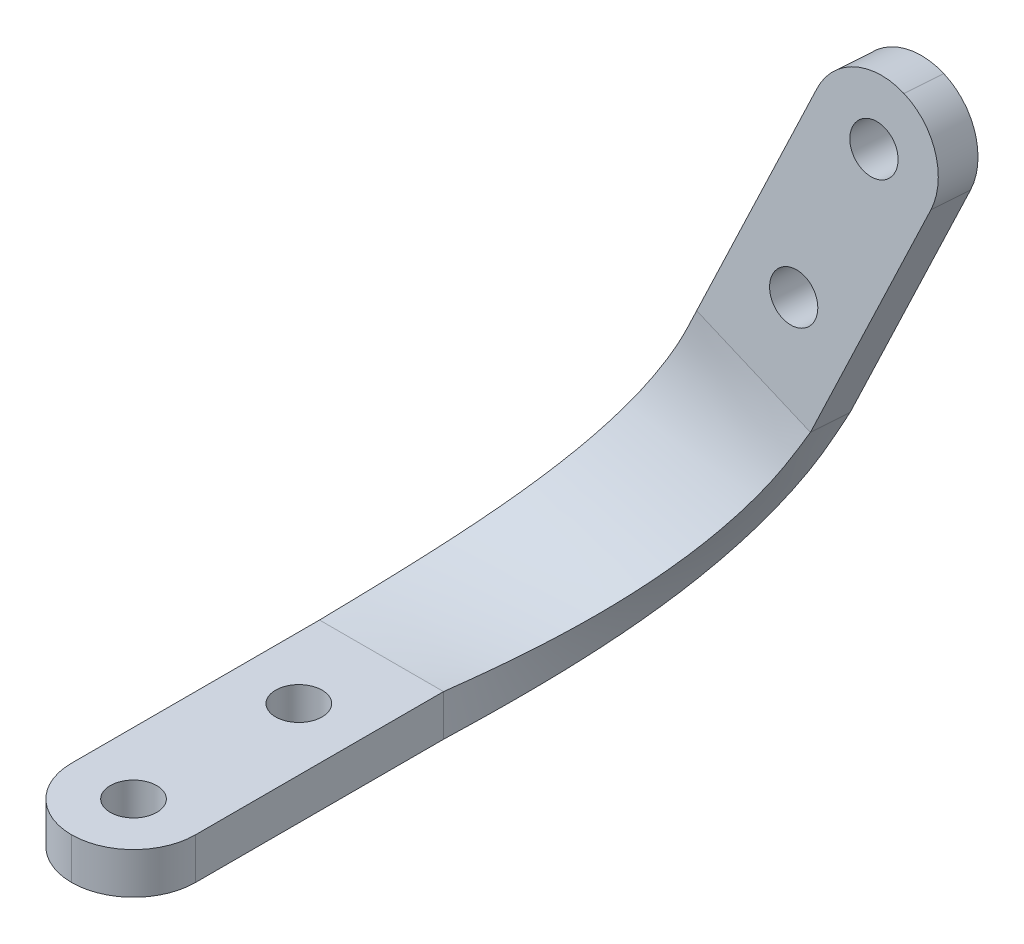
ISO-10303-21;
HEADER;
FILE_DESCRIPTION(('STEP AP214'),'2;1');
FILE_NAME('part.step','',(''),(''),'','','');
FILE_SCHEMA(('AUTOMOTIVE_DESIGN { 1 0 10303 214 1 1 1 1 }'));
ENDSEC;
DATA;
#1=APPLICATION_CONTEXT('core data for automotive mechanical design processes');
#2=APPLICATION_PROTOCOL_DEFINITION('international standard','automotive_design',2000,#1);
#3=PRODUCT_CONTEXT('',#1,'mechanical');
#4=PRODUCT('Part','Part','',(#3));
#5=PRODUCT_RELATED_PRODUCT_CATEGORY('part','',(#4));
#6=PRODUCT_DEFINITION_FORMATION('','',#4);
#7=PRODUCT_DEFINITION_CONTEXT('part definition',#1,'design');
#8=PRODUCT_DEFINITION('design','',#6,#7);
#9=PRODUCT_DEFINITION_SHAPE('','',#8);
#10=(LENGTH_UNIT() NAMED_UNIT(*) SI_UNIT(.MILLI.,.METRE.));
#11=(NAMED_UNIT(*) PLANE_ANGLE_UNIT() SI_UNIT($,.RADIAN.));
#12=(NAMED_UNIT(*) SI_UNIT($,.STERADIAN.) SOLID_ANGLE_UNIT());
#13=UNCERTAINTY_MEASURE_WITH_UNIT(LENGTH_MEASURE(1.E-05),#10,'distance_accuracy_value','');
#14=(GEOMETRIC_REPRESENTATION_CONTEXT(3) GLOBAL_UNCERTAINTY_ASSIGNED_CONTEXT((#13)) GLOBAL_UNIT_ASSIGNED_CONTEXT((#10,
#11,#12)) REPRESENTATION_CONTEXT('',''));
#15=CARTESIAN_POINT('',(0.,0.,0.));
#16=DIRECTION('',(0.,0.,1.));
#17=DIRECTION('',(1.,0.,0.));
#18=AXIS2_PLACEMENT_3D('',#15,#16,#17);
#19=CARTESIAN_POINT('',(67.9475962336638,138.021887870832,3.53139627320051));
#20=DIRECTION('',(-0.92273613938802,0.385391582492064,-0.00559867944741546));
#21=DIRECTION('',(-0.385397622724406,-0.922750601407757,0.));
#22=AXIS2_PLACEMENT_3D('',#19,#20,#21);
#23=PLANE('',#22);
#24=DIRECTION('',(-0.383930536444978,-0.917763029845186,0.101530114914024));
#25=VECTOR('',#24,1.);
#26=CARTESIAN_POINT('',(67.9475962336638,138.021887870832,3.53139627320052));
#27=LINE('',#26,#25);
#28=CARTESIAN_POINT('',(43.5680071694077,79.7439354756631,9.97855857024107));
#29=VERTEX_POINT('',#28);
#30=CARTESIAN_POINT('',(28.940253730854,44.7771640385615,13.8468559484654));
#31=VERTEX_POINT('',#30);
#32=EDGE_CURVE('E310',#29,#31,#27,.T.);
#33=ORIENTED_EDGE('',*,*,#32,.T.);
#34=CARTESIAN_POINT('',(28.7244134802613,44.1686117233405,7.52976982701167));
#35=CARTESIAN_POINT('',(28.940253730854,44.7771640385615,13.8468559484654));
#36=B_SPLINE_CURVE_WITH_KNOTS('',1,(#34,#35),.UNSPECIFIED.,.F.,.F.,(2,2),(0.,1.),.UNSPECIFIED.);
#37=CARTESIAN_POINT('',(28.7244134802613,44.1686117233405,7.52976982701167));
#38=VERTEX_POINT('',#37);
#39=EDGE_CURVE('E369',#31,#38,#36,.F.);
#40=ORIENTED_EDGE('',*,*,#39,.T.);
#41=DIRECTION('',(-0.383930536444978,-0.917763029845186,0.101530114914024));
#42=VECTOR('',#41,1.);
#43=CARTESIAN_POINT('',(67.731755983071,137.413335555611,-2.78568984825321));
#44=LINE('',#43,#42);
#45=CARTESIAN_POINT('',(43.3521669188149,79.1353831604421,3.66147244878734));
#46=VERTEX_POINT('',#45);
#47=EDGE_CURVE('E448',#46,#38,#44,.T.);
#48=ORIENTED_EDGE('',*,*,#47,.F.);
#49=DIRECTION('',(-0.033990590644525,-0.0958350102710186,-0.994816712039957));
#50=VECTOR('',#49,1.);
#51=CARTESIAN_POINT('',(43.5680071694077,79.7439354756631,9.97855857024106));
#52=LINE('',#51,#50);
#53=EDGE_CURVE('E11',#29,#46,#52,.T.);
#54=ORIENTED_EDGE('',*,*,#53,.F.);
#55=EDGE_LOOP('',(#33,#40,#48,#54));
#56=FACE_BOUND('',#55,.T.);
#57=ADVANCED_FACE('F45',(#56),#23,.F.);
#58=CARTESIAN_POINT('',(-8.14154097589269,5.49651176889982,18.8979309426246));
#59=DIRECTION('',(0.92273613938802,-0.385391582492064,0.00559867944741548));
#60=DIRECTION('',(0.385397622724406,0.922750601407756,0.));
#61=AXIS2_PLACEMENT_3D('',#58,#59,#60);
#62=PLANE('',#61);
#63=DIRECTION('',(0.383930536444978,0.917763029845186,-0.101530114914024));
#64=VECTOR('',#63,1.);
#65=CARTESIAN_POINT('',(-8.35738122648542,4.88795945367885,12.5808448211708));
#66=LINE('',#65,#64);
#67=CARTESIAN_POINT('',(11.1462900249195,51.5103213698143,7.4231149835384));
#68=VERTEX_POINT('',#67);
#69=CARTESIAN_POINT('',(25.7740434634732,86.4770928069159,3.55481760531407));
#70=VERTEX_POINT('',#69);
#71=EDGE_CURVE('E318',#68,#70,#66,.T.);
#72=ORIENTED_EDGE('',*,*,#71,.F.);
#73=CARTESIAN_POINT('',(11.3621302755122,52.1188736850353,13.7402011049921));
#74=CARTESIAN_POINT('',(11.1462900249195,51.5103213698143,7.4231149835384));
#75=B_SPLINE_CURVE_WITH_KNOTS('',1,(#73,#74),.UNSPECIFIED.,.F.,.F.,(2,2),(0.,1.),.UNSPECIFIED.);
#76=CARTESIAN_POINT('',(11.3621302755122,52.1188736850353,13.7402011049921));
#77=VERTEX_POINT('',#76);
#78=EDGE_CURVE('E476',#77,#68,#75,.T.);
#79=ORIENTED_EDGE('',*,*,#78,.F.);
#80=DIRECTION('',(0.383930536444978,0.917763029845186,-0.101530114914024));
#81=VECTOR('',#80,1.);
#82=CARTESIAN_POINT('',(-8.14154097589269,5.49651176889982,18.8979309426246));
#83=LINE('',#82,#81);
#84=CARTESIAN_POINT('',(25.9898837140659,87.0856451221369,9.8719037267678));
#85=VERTEX_POINT('',#84);
#86=EDGE_CURVE('E329',#77,#85,#83,.T.);
#87=ORIENTED_EDGE('',*,*,#86,.T.);
#88=DIRECTION('',(-0.033990590644525,-0.0958350102710186,-0.994816712039957));
#89=VECTOR('',#88,1.);
#90=CARTESIAN_POINT('',(25.9898837140659,87.0856451221369,9.8719037267678));
#91=LINE('',#90,#89);
#92=EDGE_CURVE('E440',#70,#85,#91,.F.);
#93=ORIENTED_EDGE('',*,*,#92,.F.);
#94=EDGE_LOOP('',(#72,#79,#87,#93));
#95=FACE_BOUND('',#94,.T.);
#96=ADVANCED_FACE('F289',(#95),#62,.F.);
#97=CARTESIAN_POINT('',(0.647520751778202,1.82565694566291,18.9512583643612));
#98=DIRECTION('',(0.033990590644525,0.0958350102710186,0.994816712039957));
#99=DIRECTION('',(0.,0.995391896340519,-0.0958904202703531));
#100=AXIS2_PLACEMENT_3D('',#97,#98,#99);
#101=PLANE('',#100);
#102=CARTESIAN_POINT('',(34.7789454417368,83.4147902988999,9.92523114850444));
#103=DIRECTION('',(-0.0339905906445249,-0.0958350102710186,-0.994816712039957));
#104=DIRECTION('',(0.,0.995391896340519,-0.0958904202703532));
#105=AXIS2_PLACEMENT_3D('',#102,#103,#104);
#106=CIRCLE('',#105,3.57124);
#107=CARTESIAN_POINT('',(34.7789454417368,86.9695736547871,9.58278344401814));
#108=VERTEX_POINT('',#107);
#109=EDGE_CURVE('E417',#108,#108,#106,.T.);
#110=ORIENTED_EDGE('',*,*,#109,.T.);
#111=EDGE_LOOP('',(#110));
#112=FACE_BOUND('',#111,.T.);
#113=CARTESIAN_POINT('',(25.0271098160343,60.1036093408322,12.5040960673207));
#114=DIRECTION('',(-0.0339905906445249,-0.0958350102710186,-0.994816712039957));
#115=DIRECTION('',(0.,0.995391896340519,-0.0958904202703532));
#116=AXIS2_PLACEMENT_3D('',#113,#114,#115);
#117=CIRCLE('',#116,3.57124);
#118=CARTESIAN_POINT('',(25.0271098160343,63.6583926967193,12.1616483628344));
#119=VERTEX_POINT('',#118);
#120=EDGE_CURVE('E431',#119,#119,#117,.T.);
#121=ORIENTED_EDGE('',*,*,#120,.T.);
#122=EDGE_LOOP('',(#121));
#123=FACE_BOUND('',#122,.T.);
#124=ORIENTED_EDGE('',*,*,#86,.F.);
#125=CARTESIAN_POINT('',(28.940253730854,44.7771640385615,13.8468559484654));
#126=CARTESIAN_POINT('',(11.3621302755122,52.1188736850353,13.7402011049921));
#127=B_SPLINE_CURVE_WITH_KNOTS('',1,(#125,#126),.UNSPECIFIED.,.F.,.F.,(2,2),(0.,1.),.UNSPECIFIED.);
#128=EDGE_CURVE('E161',#31,#77,#127,.T.);
#129=ORIENTED_EDGE('',*,*,#128,.F.);
#130=ORIENTED_EDGE('',*,*,#32,.F.);
#131=CARTESIAN_POINT('',(34.7789454417368,83.4147902989,9.92523114850443));
#132=DIRECTION('',(-0.033990590644525,-0.0958350102710186,-0.994816712039957));
#133=DIRECTION('',(0.,0.995391896340519,-0.0958904202703531));
#134=AXIS2_PLACEMENT_3D('',#131,#132,#133);
#135=CIRCLE('',#134,9.525);
#136=CARTESIAN_POINT('',(38.4358838013752,92.1564831581754,8.95815680394835));
#137=VERTEX_POINT('',#136);
#138=EDGE_CURVE('E69',#137,#29,#135,.T.);
#139=ORIENTED_EDGE('',*,*,#138,.F.);
#140=CARTESIAN_POINT('',(34.7789454417368,83.4147902989,9.92523114850443));
#141=DIRECTION('',(-0.033990590644525,-0.0958350102710186,-0.994816712039957));
#142=DIRECTION('',(0.,0.995391896340519,-0.0958904202703531));
#143=AXIS2_PLACEMENT_3D('',#140,#141,#142);
#144=CIRCLE('',#143,9.525);
#145=EDGE_CURVE('E57',#85,#137,#144,.T.);
#146=ORIENTED_EDGE('',*,*,#145,.F.);
#147=EDGE_LOOP('',(#124,#129,#130,#139,#146));
#148=FACE_BOUND('',#147,.T.);
#149=ADVANCED_FACE('F295',(#112,#123,#148),#101,.T.);
#150=CARTESIAN_POINT('',(0.431680501185468,1.21710463044194,12.6341722429075));
#151=DIRECTION('',(0.033990590644525,0.0958350102710186,0.994816712039957));
#152=DIRECTION('',(0.,0.995391896340519,-0.0958904202703531));
#153=AXIS2_PLACEMENT_3D('',#150,#151,#152);
#154=PLANE('',#153);
#155=CARTESIAN_POINT('',(34.5631051911441,82.806237983679,3.60814502705071));
#156=DIRECTION('',(-0.033990590644525,-0.0958350102710186,-0.994816712039957));
#157=DIRECTION('',(0.,0.995391896340519,-0.0958904202703531));
#158=AXIS2_PLACEMENT_3D('',#155,#156,#157);
#159=CIRCLE('',#158,3.57124);
#160=CARTESIAN_POINT('',(34.5631051911441,86.3610213395661,3.26569732256441));
#161=VERTEX_POINT('',#160);
#162=EDGE_CURVE('E426',#161,#161,#159,.T.);
#163=ORIENTED_EDGE('',*,*,#162,.F.);
#164=EDGE_LOOP('',(#163));
#165=FACE_BOUND('',#164,.T.);
#166=CARTESIAN_POINT('',(24.8112695654416,59.4950570256113,6.18700994586693));
#167=DIRECTION('',(-0.033990590644525,-0.0958350102710186,-0.994816712039957));
#168=DIRECTION('',(0.,0.995391896340519,-0.0958904202703531));
#169=AXIS2_PLACEMENT_3D('',#166,#167,#168);
#170=CIRCLE('',#169,3.57123999999999);
#171=CARTESIAN_POINT('',(24.8112695654416,63.0498403814984,5.84456224138063));
#172=VERTEX_POINT('',#171);
#173=EDGE_CURVE('E435',#172,#172,#170,.T.);
#174=ORIENTED_EDGE('',*,*,#173,.F.);
#175=EDGE_LOOP('',(#174));
#176=FACE_BOUND('',#175,.T.);
#177=CARTESIAN_POINT('',(34.563105191144,82.806237983679,3.60814502705071));
#178=DIRECTION('',(-0.033990590644525,-0.0958350102710186,-0.994816712039957));
#179=DIRECTION('',(0.,0.995391896340519,-0.0958904202703531));
#180=AXIS2_PLACEMENT_3D('',#177,#178,#179);
#181=CIRCLE('',#180,9.525);
#182=CARTESIAN_POINT('',(38.2200435507824,91.5479308429544,2.64107068249463));
#183=VERTEX_POINT('',#182);
#184=EDGE_CURVE('E436',#46,#183,#181,.F.);
#185=ORIENTED_EDGE('',*,*,#184,.F.);
#186=ORIENTED_EDGE('',*,*,#47,.T.);
#187=CARTESIAN_POINT('',(11.1462900249195,51.5103213698143,7.4231149835384));
#188=CARTESIAN_POINT('',(28.7244134802613,44.1686117233405,7.52976982701167));
#189=B_SPLINE_CURVE_WITH_KNOTS('',1,(#187,#188),.UNSPECIFIED.,.F.,.F.,(2,2),(0.,1.),.UNSPECIFIED.);
#190=EDGE_CURVE('E453',#38,#68,#189,.F.);
#191=ORIENTED_EDGE('',*,*,#190,.T.);
#192=ORIENTED_EDGE('',*,*,#71,.T.);
#193=CARTESIAN_POINT('',(34.563105191144,82.806237983679,3.60814502705071));
#194=DIRECTION('',(-0.033990590644525,-0.0958350102710186,-0.994816712039957));
#195=DIRECTION('',(0.,0.995391896340519,-0.0958904202703531));
#196=AXIS2_PLACEMENT_3D('',#193,#194,#195);
#197=CIRCLE('',#196,9.525);
#198=EDGE_CURVE('E438',#183,#70,#197,.F.);
#199=ORIENTED_EDGE('',*,*,#198,.F.);
#200=EDGE_LOOP('',(#185,#186,#191,#192,#199));
#201=FACE_BOUND('',#200,.T.);
#202=ADVANCED_FACE('F339',(#165,#176,#201),#154,.F.);
#203=CARTESIAN_POINT('',(34.7789454417368,83.4147902989,9.92523114850443));
#204=DIRECTION('',(-0.033990590644525,-0.0958350102710186,-0.994816712039957));
#205=DIRECTION('',(0.,-0.995391896340519,0.0958904202703532));
#206=AXIS2_PLACEMENT_3D('',#203,#204,#205);
#207=CYLINDRICAL_SURFACE('',#206,9.525);
#208=ORIENTED_EDGE('',*,*,#53,.T.);
#209=ORIENTED_EDGE('',*,*,#184,.T.);
#210=DIRECTION('',(-0.033990590644525,-0.0958350102710186,-0.994816712039957));
#211=VECTOR('',#210,1.);
#212=CARTESIAN_POINT('',(38.4358838013752,92.1564831581754,8.95815680394835));
#213=LINE('',#212,#211);
#214=EDGE_CURVE('E65',#183,#137,#213,.F.);
#215=ORIENTED_EDGE('',*,*,#214,.T.);
#216=ORIENTED_EDGE('',*,*,#138,.T.);
#217=EDGE_LOOP('',(#208,#209,#215,#216));
#218=FACE_BOUND('',#217,.T.);
#219=ADVANCED_FACE('F47',(#218),#207,.T.);
#220=CARTESIAN_POINT('',(34.7789454417368,83.4147902989,9.92523114850443));
#221=DIRECTION('',(-0.033990590644525,-0.0958350102710186,-0.994816712039957));
#222=DIRECTION('',(0.,-0.995391896340519,0.0958904202703532));
#223=AXIS2_PLACEMENT_3D('',#220,#221,#222);
#224=CYLINDRICAL_SURFACE('',#223,9.525);
#225=ORIENTED_EDGE('',*,*,#145,.T.);
#226=ORIENTED_EDGE('',*,*,#214,.F.);
#227=ORIENTED_EDGE('',*,*,#198,.T.);
#228=ORIENTED_EDGE('',*,*,#92,.T.);
#229=EDGE_LOOP('',(#225,#226,#227,#228));
#230=FACE_BOUND('',#229,.T.);
#231=ADVANCED_FACE('F302',(#230),#224,.T.);
#232=CARTESIAN_POINT('',(25.0271098160343,60.1036093408322,12.5040960673207));
#233=DIRECTION('',(0.0339905906445249,0.0958350102710186,0.994816712039957));
#234=DIRECTION('',(0.,0.995391896340519,-0.0958904202703532));
#235=AXIS2_PLACEMENT_3D('',#232,#233,#234);
#236=CYLINDRICAL_SURFACE('',#235,3.57123999999999);
#237=ORIENTED_EDGE('',*,*,#120,.F.);
#238=EDGE_LOOP('',(#237));
#239=FACE_BOUND('',#238,.T.);
#240=ORIENTED_EDGE('',*,*,#173,.T.);
#241=EDGE_LOOP('',(#240));
#242=FACE_BOUND('',#241,.T.);
#243=ADVANCED_FACE('F341',(#239,#242),#236,.F.);
#244=CARTESIAN_POINT('',(34.7789454417368,83.4147902988999,9.92523114850444));
#245=DIRECTION('',(0.0339905906445249,0.0958350102710186,0.994816712039957));
#246=DIRECTION('',(0.,0.995391896340519,-0.0958904202703532));
#247=AXIS2_PLACEMENT_3D('',#244,#245,#246);
#248=CYLINDRICAL_SURFACE('',#247,3.57124);
#249=ORIENTED_EDGE('',*,*,#109,.F.);
#250=EDGE_LOOP('',(#249));
#251=FACE_BOUND('',#250,.T.);
#252=ORIENTED_EDGE('',*,*,#162,.T.);
#253=EDGE_LOOP('',(#252));
#254=FACE_BOUND('',#253,.T.);
#255=ADVANCED_FACE('F401',(#251,#254),#248,.F.);
#256=CARTESIAN_POINT('',(9.525,19.05,50.8));
#257=CARTESIAN_POINT('',(9.61611040612505,18.876924475777,48.4959440810097));
#258=CARTESIAN_POINT('',(9.71156587801764,18.6955949598589,46.0820074697263));
#259=CARTESIAN_POINT('',(10.3655375158297,18.886471984847,41.511842331588));
#260=CARTESIAN_POINT('',(10.8895058211845,19.1827240960487,39.0431557969384));
#261=CARTESIAN_POINT('',(12.1441560299103,20.1648256421116,34.7672643005917));
#262=CARTESIAN_POINT('',(13.0642731433907,20.9970389176897,32.29846177604));
#263=CARTESIAN_POINT('',(14.8460716380314,22.8412743294573,28.4261647863728));
#264=CARTESIAN_POINT('',(16.0658145393876,24.2188407003618,26.2290099035547));
#265=CARTESIAN_POINT('',(18.2799067341088,26.9805647250252,22.8695385825727));
#266=CARTESIAN_POINT('',(19.7217361793694,28.9263661489708,21.0354139853111));
#267=CARTESIAN_POINT('',(22.248963771036,32.6515973260815,18.3145791464051));
#268=CARTESIAN_POINT('',(23.7130591318596,34.9985431884042,17.0187513865197));
#269=CARTESIAN_POINT('',(26.3407551742101,39.5905045212927,15.1075732577373));
#270=CARTESIAN_POINT('',(27.6707698929098,42.2442215165264,14.4625363243004));
#271=CARTESIAN_POINT('',(28.940253730854,44.7771640385615,13.8468559484654));
#272=CARTESIAN_POINT('',(-9.52500000000001,19.05,50.8));
#273=CARTESIAN_POINT('',(-9.27807220328473,19.366561317466,47.6925717688773));
#274=CARTESIAN_POINT('',(-9.01936839148846,19.6982194806421,44.4369499273162));
#275=CARTESIAN_POINT('',(-7.91867984453945,21.0149495661702,38.5582635246053));
#276=CARTESIAN_POINT('',(-7.09985331728687,21.9958294102407,35.4546673574179));
#277=CARTESIAN_POINT('',(-5.32085702977179,24.2029300621699,30.4102283385234));
#278=CARTESIAN_POINT('',(-4.1043673913845,25.7581367622148,27.703852072313));
#279=CARTESIAN_POINT('',(-1.91486502492143,28.7044192827428,23.7456187174874));
#280=CARTESIAN_POINT('',(-0.503972486492755,30.6908928724349,21.6844589404929));
#281=CARTESIAN_POINT('',(1.8768136610878,34.2492842129785,18.8065022611776));
#282=CARTESIAN_POINT('',(3.33104028353604,36.5531304365608,17.4096237816986));
#283=CARTESIAN_POINT('',(5.729119324207,40.6211910557167,15.5592146891756));
#284=CARTESIAN_POINT('',(7.03385985185043,43.0061874678768,14.8301328558502));
#285=CARTESIAN_POINT('',(9.28487648729542,47.4509723567273,13.9481378914418));
#286=CARTESIAN_POINT('',(10.3476884306765,49.8392704599211,13.8417485319131));
#287=CARTESIAN_POINT('',(11.3621302755122,52.1188736850353,13.7402011049921));
#288=B_SPLINE_SURFACE_WITH_KNOTS('',1,3,((#256,#257,#258,#259,#260,#261,#262,#263,#264,#265,
#266,#267,#268,#269,#270,#271),(#272,#273,#274,#275,#276,#277,#278,#279,#280,#281,#282,#283,
#284,#285,#286,#287)),.UNSPECIFIED.,.F.,.F.,.F.,(2,2),(4,1,1,1,1,1,1,1,1,1,1,1,1,4),(0.,1.),(0.,
0.140011963127104,0.146689149783437,0.279955434978133,0.293309005980818,0.419938993708348,
0.439965496089714,0.559922491920345,0.579943655684751,0.706609918539249,0.719967302531779,
0.853284521254399,0.85996175348655,1.),.UNSPECIFIED.);
#289=CARTESIAN_POINT('',(-9.52500000000001,19.05,50.8));
#290=CARTESIAN_POINT('',(9.525,19.05,50.8));
#291=B_SPLINE_CURVE_WITH_KNOTS('',1,(#289,#290),.UNSPECIFIED.,.F.,.F.,(2,2),(0.,1.),.UNSPECIFIED.);
#292=CARTESIAN_POINT('',(9.525,19.05,50.8));
#293=VERTEX_POINT('',#292);
#294=CARTESIAN_POINT('',(-9.525,19.05,50.8));
#295=VERTEX_POINT('',#294);
#296=EDGE_CURVE('E153',#293,#295,#291,.F.);
#297=CARTESIAN_POINT('',(9.525,19.05,50.8));
#298=CARTESIAN_POINT('',(9.61611040612505,18.876924475777,48.4959440810097));
#299=CARTESIAN_POINT('',(9.71156587801764,18.6955949598589,46.0820074697263));
#300=CARTESIAN_POINT('',(10.3655375158297,18.886471984847,41.511842331588));
#301=CARTESIAN_POINT('',(10.8895058211845,19.1827240960487,39.0431557969384));
#302=CARTESIAN_POINT('',(12.1441560299103,20.1648256421116,34.7672643005917));
#303=CARTESIAN_POINT('',(13.0642731433907,20.9970389176897,32.29846177604));
#304=CARTESIAN_POINT('',(14.8460716380314,22.8412743294573,28.4261647863728));
#305=CARTESIAN_POINT('',(16.0658145393876,24.2188407003618,26.2290099035547));
#306=CARTESIAN_POINT('',(18.2799067341088,26.9805647250252,22.8695385825727));
#307=CARTESIAN_POINT('',(19.7217361793694,28.9263661489708,21.0354139853111));
#308=CARTESIAN_POINT('',(22.248963771036,32.6515973260815,18.3145791464051));
#309=CARTESIAN_POINT('',(23.7130591318596,34.9985431884042,17.0187513865197));
#310=CARTESIAN_POINT('',(26.3407551742101,39.5905045212927,15.1075732577373));
#311=CARTESIAN_POINT('',(27.6707698929098,42.2442215165264,14.4625363243004));
#312=CARTESIAN_POINT('',(28.940253730854,44.7771640385615,13.8468559484654));
#313=B_SPLINE_CURVE_WITH_KNOTS('',3,(#297,#298,#299,#300,#301,#302,#303,#304,#305,#306,#307,
#308,#309,#310,#311,#312),.UNSPECIFIED.,.F.,.F.,(4,1,1,1,1,1,1,1,1,1,1,1,1,4),(0.,
0.140011963127104,0.146689149783437,0.279955434978133,0.293309005980818,0.419938993708348,
0.439965496089714,0.559922491920345,0.579943655684751,0.706609918539249,0.719967302531779,
0.853284521254399,0.85996175348655,1.),.UNSPECIFIED.);
#314=EDGE_CURVE('E152',#31,#293,#313,.F.);
#315=CARTESIAN_POINT('',(-9.52500000000001,19.05,50.8));
#316=CARTESIAN_POINT('',(-9.27807220328473,19.366561317466,47.6925717688773));
#317=CARTESIAN_POINT('',(-9.01936839148846,19.6982194806421,44.4369499273162));
#318=CARTESIAN_POINT('',(-7.91867984453945,21.0149495661702,38.5582635246053));
#319=CARTESIAN_POINT('',(-7.09985331728687,21.9958294102407,35.4546673574179));
#320=CARTESIAN_POINT('',(-5.32085702977179,24.2029300621699,30.4102283385234));
#321=CARTESIAN_POINT('',(-4.1043673913845,25.7581367622148,27.703852072313));
#322=CARTESIAN_POINT('',(-1.91486502492143,28.7044192827428,23.7456187174874));
#323=CARTESIAN_POINT('',(-0.503972486492755,30.6908928724349,21.6844589404929));
#324=CARTESIAN_POINT('',(1.8768136610878,34.2492842129785,18.8065022611776));
#325=CARTESIAN_POINT('',(3.33104028353604,36.5531304365608,17.4096237816986));
#326=CARTESIAN_POINT('',(5.729119324207,40.6211910557167,15.5592146891756));
#327=CARTESIAN_POINT('',(7.03385985185043,43.0061874678768,14.8301328558502));
#328=CARTESIAN_POINT('',(9.28487648729542,47.4509723567273,13.9481378914418));
#329=CARTESIAN_POINT('',(10.3476884306765,49.8392704599211,13.8417485319131));
#330=CARTESIAN_POINT('',(11.3621302755122,52.1188736850353,13.7402011049921));
#331=B_SPLINE_CURVE_WITH_KNOTS('',3,(#315,#316,#317,#318,#319,#320,#321,#322,#323,#324,#325,
#326,#327,#328,#329,#330),.UNSPECIFIED.,.F.,.F.,(4,1,1,1,1,1,1,1,1,1,1,1,1,4),(0.,
0.140011963127104,0.146689149783437,0.279955434978133,0.293309005980818,0.419938993708348,
0.439965496089714,0.559922491920345,0.579943655684751,0.706609918539249,0.719967302531779,
0.853284521254399,0.85996175348655,1.),.UNSPECIFIED.);
#332=EDGE_CURVE('E148',#295,#77,#331,.T.);
#333=ORIENTED_EDGE('',*,*,#296,.F.);
#334=ORIENTED_EDGE('',*,*,#314,.F.);
#335=ORIENTED_EDGE('',*,*,#128,.T.);
#336=ORIENTED_EDGE('',*,*,#332,.F.);
#337=EDGE_LOOP('',(#333,#334,#335,#336));
#338=FACE_BOUND('',#337,.T.);
#339=ADVANCED_FACE('F158',(#338),#288,.F.);
#340=CARTESIAN_POINT('',(-9.525,19.05,50.8));
#341=CARTESIAN_POINT('',(-9.27807220328466,19.366561317466,47.6925717688773));
#342=CARTESIAN_POINT('',(-9.01936839148831,19.6982194806421,44.4369499273162));
#343=CARTESIAN_POINT('',(-7.91867984453961,21.0149495661702,38.5582635246053));
#344=CARTESIAN_POINT('',(-7.09985331728689,21.9958294102407,35.4546673574179));
#345=CARTESIAN_POINT('',(-5.32085702977176,24.2029300621699,30.4102283385234));
#346=CARTESIAN_POINT('',(-4.10436739138447,25.7581367622148,27.703852072313));
#347=CARTESIAN_POINT('',(-1.91486502492146,28.7044192827428,23.7456187174874));
#348=CARTESIAN_POINT('',(-0.50397248649277,30.6908928724349,21.6844589404929));
#349=CARTESIAN_POINT('',(1.87681366108782,34.2492842129785,18.8065022611776));
#350=CARTESIAN_POINT('',(3.33104028353601,36.5531304365608,17.4096237816986));
#351=CARTESIAN_POINT('',(5.72911932420703,40.6211910557167,15.5592146891756));
#352=CARTESIAN_POINT('',(7.03385985185037,43.0061874678768,14.8301328558502));
#353=CARTESIAN_POINT('',(9.28487648729548,47.4509723567272,13.9481378914418));
#354=CARTESIAN_POINT('',(10.3476884306765,49.839270459921,13.8417485319131));
#355=CARTESIAN_POINT('',(11.3621302755122,52.1188736850353,13.7402011049921));
#356=CARTESIAN_POINT('',(-9.525,12.7,50.8));
#357=CARTESIAN_POINT('',(-9.42201153786485,13.0684620900367,47.389223006648));
#358=CARTESIAN_POINT('',(-9.31411154410222,13.4544961796084,43.8157856654294));
#359=CARTESIAN_POINT('',(-8.42109229058163,14.9619542469397,37.2223226644498));
#360=CARTESIAN_POINT('',(-7.68420892622001,16.0880655021916,33.6779847690266));
#361=CARTESIAN_POINT('',(-5.97688155262795,18.6465230539253,27.8353306110806));
#362=CARTESIAN_POINT('',(-4.77155017791142,20.4561473053638,24.6650520238422));
#363=CARTESIAN_POINT('',(-2.54264240674776,23.9163022179907,19.9624609597229));
#364=CARTESIAN_POINT('',(-1.07537509875751,26.2746479057179,17.4648954350996));
#365=CARTESIAN_POINT('',(1.40649864569712,30.4900305577822,13.9650182830027));
#366=CARTESIAN_POINT('',(2.92383211091407,33.2186453063096,12.2464829943563));
#367=CARTESIAN_POINT('',(5.4273246194026,38.0442184100559,9.93095684895902));
#368=CARTESIAN_POINT('',(6.77956036598728,40.8688186644527,8.9937137034594));
#369=CARTESIAN_POINT('',(9.07861776753516,46.084311324073,7.8185610053878));
#370=CARTESIAN_POINT('',(10.1365273896581,48.8604902937453,7.61623389573556));
#371=CARTESIAN_POINT('',(11.1462900249195,51.5103213698143,7.4231149835384));
#372=B_SPLINE_SURFACE_WITH_KNOTS('',1,3,((#340,#341,#342,#343,#344,#345,#346,#347,#348,#349,
#350,#351,#352,#353,#354,#355),(#356,#357,#358,#359,#360,#361,#362,#363,#364,#365,#366,#367,
#368,#369,#370,#371)),.UNSPECIFIED.,.F.,.F.,.F.,(2,2),(4,1,1,1,1,1,1,1,1,1,1,1,1,4),(0.,1.),(0.,
0.140011963127104,0.146689149783437,0.279955434978133,0.293309005980818,0.419938993708348,
0.439965496089714,0.559922491920345,0.579943655684751,0.706609918539249,0.719967302531779,
0.853284521254399,0.85996175348655,1.),.UNSPECIFIED.);
#373=CARTESIAN_POINT('',(-9.525,12.7,50.8));
#374=CARTESIAN_POINT('',(-9.525,19.05,50.8));
#375=B_SPLINE_CURVE_WITH_KNOTS('',1,(#373,#374),.UNSPECIFIED.,.F.,.F.,(2,2),(0.,1.),.UNSPECIFIED.);
#376=CARTESIAN_POINT('',(-9.525,12.7,50.8));
#377=VERTEX_POINT('',#376);
#378=EDGE_CURVE('E131',#295,#377,#375,.F.);
#379=CARTESIAN_POINT('',(-9.525,12.7,50.8));
#380=CARTESIAN_POINT('',(-9.42201153786485,13.0684620900367,47.389223006648));
#381=CARTESIAN_POINT('',(-9.31411154410222,13.4544961796084,43.8157856654294));
#382=CARTESIAN_POINT('',(-8.42109229058163,14.9619542469397,37.2223226644498));
#383=CARTESIAN_POINT('',(-7.68420892622001,16.0880655021916,33.6779847690266));
#384=CARTESIAN_POINT('',(-5.97688155262795,18.6465230539253,27.8353306110806));
#385=CARTESIAN_POINT('',(-4.77155017791142,20.4561473053638,24.6650520238422));
#386=CARTESIAN_POINT('',(-2.54264240674776,23.9163022179907,19.9624609597229));
#387=CARTESIAN_POINT('',(-1.07537509875751,26.2746479057179,17.4648954350996));
#388=CARTESIAN_POINT('',(1.40649864569712,30.4900305577822,13.9650182830027));
#389=CARTESIAN_POINT('',(2.92383211091407,33.2186453063096,12.2464829943563));
#390=CARTESIAN_POINT('',(5.4273246194026,38.0442184100559,9.93095684895902));
#391=CARTESIAN_POINT('',(6.77956036598728,40.8688186644527,8.9937137034594));
#392=CARTESIAN_POINT('',(9.07861776753516,46.084311324073,7.8185610053878));
#393=CARTESIAN_POINT('',(10.1365273896581,48.8604902937453,7.61623389573556));
#394=CARTESIAN_POINT('',(11.1462900249195,51.5103213698143,7.4231149835384));
#395=B_SPLINE_CURVE_WITH_KNOTS('',3,(#379,#380,#381,#382,#383,#384,#385,#386,#387,#388,#389,
#390,#391,#392,#393,#394),.UNSPECIFIED.,.F.,.F.,(4,1,1,1,1,1,1,1,1,1,1,1,1,4),(0.,
0.140011963127104,0.146689149783437,0.279955434978133,0.293309005980818,0.419938993708348,
0.439965496089714,0.559922491920345,0.579943655684751,0.706609918539249,0.719967302531779,
0.853284521254399,0.85996175348655,1.),.UNSPECIFIED.);
#396=EDGE_CURVE('E150',#377,#68,#395,.T.);
#397=ORIENTED_EDGE('',*,*,#378,.F.);
#398=ORIENTED_EDGE('',*,*,#332,.T.);
#399=ORIENTED_EDGE('',*,*,#78,.T.);
#400=ORIENTED_EDGE('',*,*,#396,.F.);
#401=EDGE_LOOP('',(#397,#398,#399,#400));
#402=FACE_BOUND('',#401,.T.);
#403=ADVANCED_FACE('F146',(#402),#372,.F.);
#404=CARTESIAN_POINT('',(9.525,12.7,50.8));
#405=CARTESIAN_POINT('',(9.47217107154484,12.5788252483477,48.1925953187804));
#406=CARTESIAN_POINT('',(9.41682272540371,12.4518716588252,45.4608432078394));
#407=CARTESIAN_POINT('',(9.86312506978771,12.8334766656164,40.1759014714326));
#408=CARTESIAN_POINT('',(10.3051502122514,13.2749601879996,37.2664732085471));
#409=CARTESIAN_POINT('',(11.4881315070541,14.6084186338671,32.1923665731489));
#410=CARTESIAN_POINT('',(12.3970903568637,15.6950494608388,29.2596617275691));
#411=CARTESIAN_POINT('',(14.2182942562051,18.0531572647052,24.6430070286083));
#412=CARTESIAN_POINT('',(15.4944119271228,19.8025957336448,22.0094463981613));
#413=CARTESIAN_POINT('',(17.8095917187181,23.2213110698289,18.0280546043978));
#414=CARTESIAN_POINT('',(19.3145280067474,25.5918810187197,15.8722731979688));
#415=CARTESIAN_POINT('',(21.9471690662316,30.0746246804207,12.6863213061886));
#416=CARTESIAN_POINT('',(23.4587596459966,32.8611743849802,11.1823322341289));
#417=CARTESIAN_POINT('',(26.1344964544497,38.2238434886384,8.97799637168323));
#418=CARTESIAN_POINT('',(27.4596088518913,41.2654413503507,8.23702168812289));
#419=CARTESIAN_POINT('',(28.7244134802613,44.1686117233405,7.52976982701167));
#420=CARTESIAN_POINT('',(9.525,19.05,50.8));
#421=CARTESIAN_POINT('',(9.61611040612505,18.876924475777,48.4959440810097));
#422=CARTESIAN_POINT('',(9.71156587801764,18.6955949598589,46.0820074697263));
#423=CARTESIAN_POINT('',(10.3655375158297,18.886471984847,41.511842331588));
#424=CARTESIAN_POINT('',(10.8895058211845,19.1827240960487,39.0431557969384));
#425=CARTESIAN_POINT('',(12.1441560299103,20.1648256421116,34.7672643005917));
#426=CARTESIAN_POINT('',(13.0642731433907,20.9970389176897,32.29846177604));
#427=CARTESIAN_POINT('',(14.8460716380314,22.8412743294573,28.4261647863728));
#428=CARTESIAN_POINT('',(16.0658145393876,24.2188407003618,26.2290099035547));
#429=CARTESIAN_POINT('',(18.2799067341088,26.9805647250252,22.8695385825727));
#430=CARTESIAN_POINT('',(19.7217361793694,28.9263661489708,21.0354139853111));
#431=CARTESIAN_POINT('',(22.248963771036,32.6515973260815,18.3145791464051));
#432=CARTESIAN_POINT('',(23.7130591318596,34.9985431884042,17.0187513865196));
#433=CARTESIAN_POINT('',(26.3407551742101,39.5905045212927,15.1075732577373));
#434=CARTESIAN_POINT('',(27.6707698929098,42.2442215165264,14.4625363243004));
#435=CARTESIAN_POINT('',(28.940253730854,44.7771640385615,13.8468559484654));
#436=B_SPLINE_SURFACE_WITH_KNOTS('',1,3,((#404,#405,#406,#407,#408,#409,#410,#411,#412,#413,
#414,#415,#416,#417,#418,#419),(#420,#421,#422,#423,#424,#425,#426,#427,#428,#429,#430,#431,
#432,#433,#434,#435)),.UNSPECIFIED.,.F.,.F.,.F.,(2,2),(4,1,1,1,1,1,1,1,1,1,1,1,1,4),(0.,1.),(0.,
0.140011963127104,0.146689149783437,0.279955434978133,0.293309005980818,0.419938993708348,
0.439965496089714,0.559922491920345,0.579943655684751,0.706609918539249,0.719967302531779,
0.853284521254399,0.85996175348655,1.),.UNSPECIFIED.);
#437=CARTESIAN_POINT('',(9.525,19.05,50.8));
#438=CARTESIAN_POINT('',(9.525,12.7,50.8));
#439=B_SPLINE_CURVE_WITH_KNOTS('',1,(#437,#438),.UNSPECIFIED.,.F.,.F.,(2,2),(0.,1.),.UNSPECIFIED.);
#440=CARTESIAN_POINT('',(9.525,12.7,50.8));
#441=VERTEX_POINT('',#440);
#442=EDGE_CURVE('E170',#441,#293,#439,.F.);
#443=CARTESIAN_POINT('',(9.525,12.7,50.8));
#444=CARTESIAN_POINT('',(9.47217107154489,12.5788252483477,48.1925953187804));
#445=CARTESIAN_POINT('',(9.4168227254038,12.4518716588252,45.4608432078394));
#446=CARTESIAN_POINT('',(9.86312506978762,12.8334766656164,40.1759014714326));
#447=CARTESIAN_POINT('',(10.3051502122513,13.2749601879996,37.2664732085471));
#448=CARTESIAN_POINT('',(11.4881315070541,14.6084186338671,32.1923665731489));
#449=CARTESIAN_POINT('',(12.3970903568638,15.6950494608388,29.2596617275691));
#450=CARTESIAN_POINT('',(14.2182942562051,18.0531572647052,24.6430070286083));
#451=CARTESIAN_POINT('',(15.4944119271228,19.8025957336448,22.0094463981613));
#452=CARTESIAN_POINT('',(17.8095917187181,23.2213110698289,18.0280546043978));
#453=CARTESIAN_POINT('',(19.3145280067474,25.5918810187197,15.8722731979688));
#454=CARTESIAN_POINT('',(21.9471690662316,30.0746246804207,12.6863213061886));
#455=CARTESIAN_POINT('',(23.4587596459966,32.8611743849801,11.1823322341289));
#456=CARTESIAN_POINT('',(26.1344964544496,38.2238434886384,8.97799637168323));
#457=CARTESIAN_POINT('',(27.4596088518913,41.2654413503507,8.23702168812289));
#458=CARTESIAN_POINT('',(28.7244134802613,44.1686117233405,7.52976982701167));
#459=B_SPLINE_CURVE_WITH_KNOTS('',3,(#443,#444,#445,#446,#447,#448,#449,#450,#451,#452,#453,
#454,#455,#456,#457,#458),.UNSPECIFIED.,.F.,.F.,(4,1,1,1,1,1,1,1,1,1,1,1,1,4),(0.,
0.140011963127104,0.146689149783437,0.279955434978133,0.293309005980818,0.419938993708348,
0.439965496089714,0.559922491920345,0.579943655684751,0.706609918539249,0.719967302531779,
0.853284521254399,0.85996175348655,1.),.UNSPECIFIED.);
#460=EDGE_CURVE('E427',#441,#38,#459,.T.);
#461=ORIENTED_EDGE('',*,*,#442,.F.);
#462=ORIENTED_EDGE('',*,*,#460,.T.);
#463=ORIENTED_EDGE('',*,*,#39,.F.);
#464=ORIENTED_EDGE('',*,*,#314,.T.);
#465=EDGE_LOOP('',(#461,#462,#463,#464));
#466=FACE_BOUND('',#465,.T.);
#467=ADVANCED_FACE('F368',(#466),#436,.F.);
#468=CARTESIAN_POINT('',(-9.525,12.7,50.8));
#469=CARTESIAN_POINT('',(-9.42201153786485,13.0684620900367,47.389223006648));
#470=CARTESIAN_POINT('',(-9.31411154410222,13.4544961796084,43.8157856654294));
#471=CARTESIAN_POINT('',(-8.42109229058163,14.9619542469397,37.2223226644498));
#472=CARTESIAN_POINT('',(-7.68420892622001,16.0880655021916,33.6779847690266));
#473=CARTESIAN_POINT('',(-5.97688155262795,18.6465230539253,27.8353306110806));
#474=CARTESIAN_POINT('',(-4.77155017791142,20.4561473053638,24.6650520238422));
#475=CARTESIAN_POINT('',(-2.54264240674776,23.9163022179907,19.9624609597229));
#476=CARTESIAN_POINT('',(-1.07537509875751,26.2746479057179,17.4648954350996));
#477=CARTESIAN_POINT('',(1.40649864569713,30.4900305577822,13.9650182830027));
#478=CARTESIAN_POINT('',(2.92383211091407,33.2186453063096,12.2464829943563));
#479=CARTESIAN_POINT('',(5.4273246194026,38.0442184100559,9.93095684895901));
#480=CARTESIAN_POINT('',(6.77956036598728,40.8688186644527,8.9937137034594));
#481=CARTESIAN_POINT('',(9.07861776753516,46.084311324073,7.8185610053878));
#482=CARTESIAN_POINT('',(10.1365273896581,48.8604902937453,7.61623389573556));
#483=CARTESIAN_POINT('',(11.1462900249195,51.5103213698143,7.4231149835384));
#484=CARTESIAN_POINT('',(9.525,12.7,50.8));
#485=CARTESIAN_POINT('',(9.47217107154489,12.5788252483477,48.1925953187804));
#486=CARTESIAN_POINT('',(9.4168227254038,12.4518716588252,45.4608432078394));
#487=CARTESIAN_POINT('',(9.86312506978762,12.8334766656164,40.1759014714326));
#488=CARTESIAN_POINT('',(10.3051502122513,13.2749601879996,37.2664732085471));
#489=CARTESIAN_POINT('',(11.4881315070541,14.6084186338671,32.1923665731489));
#490=CARTESIAN_POINT('',(12.3970903568638,15.6950494608388,29.2596617275691));
#491=CARTESIAN_POINT('',(14.2182942562051,18.0531572647052,24.6430070286083));
#492=CARTESIAN_POINT('',(15.4944119271228,19.8025957336448,22.0094463981613));
#493=CARTESIAN_POINT('',(17.8095917187181,23.2213110698289,18.0280546043978));
#494=CARTESIAN_POINT('',(19.3145280067474,25.5918810187197,15.8722731979688));
#495=CARTESIAN_POINT('',(21.9471690662316,30.0746246804207,12.6863213061886));
#496=CARTESIAN_POINT('',(23.4587596459966,32.8611743849801,11.1823322341289));
#497=CARTESIAN_POINT('',(26.1344964544496,38.2238434886384,8.97799637168323));
#498=CARTESIAN_POINT('',(27.4596088518913,41.2654413503507,8.23702168812289));
#499=CARTESIAN_POINT('',(28.7244134802613,44.1686117233405,7.52976982701167));
#500=B_SPLINE_SURFACE_WITH_KNOTS('',1,3,((#468,#469,#470,#471,#472,#473,#474,#475,#476,#477,
#478,#479,#480,#481,#482,#483),(#484,#485,#486,#487,#488,#489,#490,#491,#492,#493,#494,#495,
#496,#497,#498,#499)),.UNSPECIFIED.,.F.,.F.,.F.,(2,2),(4,1,1,1,1,1,1,1,1,1,1,1,1,4),(0.,1.),(0.,
0.140011963127104,0.146689149783437,0.279955434978133,0.293309005980818,0.419938993708348,
0.439965496089714,0.559922491920345,0.579943655684751,0.706609918539249,0.719967302531779,
0.853284521254399,0.85996175348655,1.),.UNSPECIFIED.);
#501=CARTESIAN_POINT('',(9.525,12.7,50.8));
#502=CARTESIAN_POINT('',(-9.525,12.7,50.8));
#503=B_SPLINE_CURVE_WITH_KNOTS('',1,(#501,#502),.UNSPECIFIED.,.F.,.F.,(2,2),(0.,1.),.UNSPECIFIED.);
#504=EDGE_CURVE('E218',#377,#441,#503,.F.);
#505=ORIENTED_EDGE('',*,*,#504,.F.);
#506=ORIENTED_EDGE('',*,*,#396,.T.);
#507=ORIENTED_EDGE('',*,*,#190,.F.);
#508=ORIENTED_EDGE('',*,*,#460,.F.);
#509=EDGE_LOOP('',(#505,#506,#507,#508));
#510=FACE_BOUND('',#509,.T.);
#511=ADVANCED_FACE('F188',(#510),#500,.F.);
#512=CARTESIAN_POINT('',(-9.525,19.05,152.4));
#513=DIRECTION('',(1.,0.,0.));
#514=DIRECTION('',(0.,0.,1.));
#515=AXIS2_PLACEMENT_3D('',#512,#513,#514);
#516=PLANE('',#515);
#517=DIRECTION('',(0.,0.,-1.));
#518=VECTOR('',#517,1.);
#519=CARTESIAN_POINT('',(-9.525,19.05,152.4));
#520=LINE('',#519,#518);
#521=CARTESIAN_POINT('',(-9.525,19.05,88.9));
#522=VERTEX_POINT('',#521);
#523=EDGE_CURVE('E127',#522,#295,#520,.T.);
#524=ORIENTED_EDGE('',*,*,#523,.T.);
#525=ORIENTED_EDGE('',*,*,#378,.T.);
#526=DIRECTION('',(0.,0.,-1.));
#527=VECTOR('',#526,1.);
#528=CARTESIAN_POINT('',(-9.525,12.7,152.4));
#529=LINE('',#528,#527);
#530=CARTESIAN_POINT('',(-9.525,12.7,88.9));
#531=VERTEX_POINT('',#530);
#532=EDGE_CURVE('E211',#531,#377,#529,.T.);
#533=ORIENTED_EDGE('',*,*,#532,.F.);
#534=DIRECTION('',(0.,-1.,0.));
#535=VECTOR('',#534,1.);
#536=CARTESIAN_POINT('',(-9.525,19.05,88.9));
#537=LINE('',#536,#535);
#538=EDGE_CURVE('E134',#522,#531,#537,.T.);
#539=ORIENTED_EDGE('',*,*,#538,.F.);
#540=EDGE_LOOP('',(#524,#525,#533,#539));
#541=FACE_BOUND('',#540,.T.);
#542=ADVANCED_FACE('F129',(#541),#516,.F.);
#543=CARTESIAN_POINT('',(9.525,19.05,0.));
#544=DIRECTION('',(-1.,0.,0.));
#545=DIRECTION('',(0.,0.,-1.));
#546=AXIS2_PLACEMENT_3D('',#543,#544,#545);
#547=PLANE('',#546);
#548=DIRECTION('',(0.,0.,1.));
#549=VECTOR('',#548,1.);
#550=CARTESIAN_POINT('',(9.525,12.7,0.));
#551=LINE('',#550,#549);
#552=CARTESIAN_POINT('',(9.525,12.7,88.9));
#553=VERTEX_POINT('',#552);
#554=EDGE_CURVE('E140',#441,#553,#551,.T.);
#555=ORIENTED_EDGE('',*,*,#554,.F.);
#556=ORIENTED_EDGE('',*,*,#442,.T.);
#557=DIRECTION('',(0.,0.,1.));
#558=VECTOR('',#557,1.);
#559=CARTESIAN_POINT('',(9.525,19.05,0.));
#560=LINE('',#559,#558);
#561=CARTESIAN_POINT('',(9.525,19.05,88.9));
#562=VERTEX_POINT('',#561);
#563=EDGE_CURVE('E139',#293,#562,#560,.T.);
#564=ORIENTED_EDGE('',*,*,#563,.T.);
#565=DIRECTION('',(0.,-1.,0.));
#566=VECTOR('',#565,1.);
#567=CARTESIAN_POINT('',(9.525,19.05,88.9));
#568=LINE('',#567,#566);
#569=EDGE_CURVE('E244',#553,#562,#568,.F.);
#570=ORIENTED_EDGE('',*,*,#569,.F.);
#571=EDGE_LOOP('',(#555,#556,#564,#570));
#572=FACE_BOUND('',#571,.T.);
#573=ADVANCED_FACE('F187',(#572),#547,.F.);
#574=CARTESIAN_POINT('',(0.,19.05,0.));
#575=DIRECTION('',(0.,1.,0.));
#576=DIRECTION('',(0.,0.,-1.));
#577=AXIS2_PLACEMENT_3D('',#574,#575,#576);
#578=PLANE('',#577);
#579=CARTESIAN_POINT('',(0.,19.05,88.9));
#580=DIRECTION('',(0.,-1.,0.));
#581=DIRECTION('',(0.,0.,-1.));
#582=AXIS2_PLACEMENT_3D('',#579,#580,#581);
#583=CIRCLE('',#582,3.57123999999999);
#584=CARTESIAN_POINT('',(0.,19.05,85.32876));
#585=VERTEX_POINT('',#584);
#586=EDGE_CURVE('E269',#585,#585,#583,.T.);
#587=ORIENTED_EDGE('',*,*,#586,.T.);
#588=EDGE_LOOP('',(#587));
#589=FACE_BOUND('',#588,.T.);
#590=CARTESIAN_POINT('',(0.,19.05,63.5));
#591=DIRECTION('',(0.,-1.,0.));
#592=DIRECTION('',(0.,0.,-1.));
#593=AXIS2_PLACEMENT_3D('',#590,#591,#592);
#594=CIRCLE('',#593,3.57123999999999);
#595=CARTESIAN_POINT('',(0.,19.05,59.92876));
#596=VERTEX_POINT('',#595);
#597=EDGE_CURVE('E241',#596,#596,#594,.T.);
#598=ORIENTED_EDGE('',*,*,#597,.T.);
#599=EDGE_LOOP('',(#598));
#600=FACE_BOUND('',#599,.T.);
#601=CARTESIAN_POINT('',(0.,19.05,88.9));
#602=DIRECTION('',(0.,-1.,0.));
#603=DIRECTION('',(0.,0.,-1.));
#604=AXIS2_PLACEMENT_3D('',#601,#602,#603);
#605=CIRCLE('',#604,9.525);
#606=CARTESIAN_POINT('',(0.,19.05,98.425));
#607=VERTEX_POINT('',#606);
#608=EDGE_CURVE('E251',#562,#607,#605,.T.);
#609=ORIENTED_EDGE('',*,*,#608,.F.);
#610=ORIENTED_EDGE('',*,*,#563,.F.);
#611=ORIENTED_EDGE('',*,*,#296,.T.);
#612=ORIENTED_EDGE('',*,*,#523,.F.);
#613=CARTESIAN_POINT('',(0.,19.05,88.9));
#614=DIRECTION('',(0.,-1.,0.));
#615=DIRECTION('',(0.,0.,-1.));
#616=AXIS2_PLACEMENT_3D('',#613,#614,#615);
#617=CIRCLE('',#616,9.525);
#618=EDGE_CURVE('E248',#607,#522,#617,.T.);
#619=ORIENTED_EDGE('',*,*,#618,.F.);
#620=EDGE_LOOP('',(#609,#610,#611,#612,#619));
#621=FACE_BOUND('',#620,.T.);
#622=ADVANCED_FACE('F166',(#589,#600,#621),#578,.T.);
#623=CARTESIAN_POINT('',(0.,12.7,0.));
#624=DIRECTION('',(0.,1.,0.));
#625=DIRECTION('',(0.,0.,-1.));
#626=AXIS2_PLACEMENT_3D('',#623,#624,#625);
#627=PLANE('',#626);
#628=CARTESIAN_POINT('',(0.,12.7,88.9));
#629=DIRECTION('',(0.,-1.,0.));
#630=DIRECTION('',(0.,0.,-1.));
#631=AXIS2_PLACEMENT_3D('',#628,#629,#630);
#632=CIRCLE('',#631,3.57124);
#633=CARTESIAN_POINT('',(0.,12.7,85.32876));
#634=VERTEX_POINT('',#633);
#635=EDGE_CURVE('E265',#634,#634,#632,.T.);
#636=ORIENTED_EDGE('',*,*,#635,.F.);
#637=EDGE_LOOP('',(#636));
#638=FACE_BOUND('',#637,.T.);
#639=CARTESIAN_POINT('',(0.,12.7,63.5));
#640=DIRECTION('',(0.,-1.,0.));
#641=DIRECTION('',(0.,0.,-1.));
#642=AXIS2_PLACEMENT_3D('',#639,#640,#641);
#643=CIRCLE('',#642,3.57124);
#644=CARTESIAN_POINT('',(0.,12.7,59.92876));
#645=VERTEX_POINT('',#644);
#646=EDGE_CURVE('E234',#645,#645,#643,.T.);
#647=ORIENTED_EDGE('',*,*,#646,.F.);
#648=EDGE_LOOP('',(#647));
#649=FACE_BOUND('',#648,.T.);
#650=ORIENTED_EDGE('',*,*,#532,.T.);
#651=ORIENTED_EDGE('',*,*,#504,.T.);
#652=ORIENTED_EDGE('',*,*,#554,.T.);
#653=CARTESIAN_POINT('',(0.,12.7,88.9));
#654=DIRECTION('',(0.,-1.,0.));
#655=DIRECTION('',(0.,0.,-1.));
#656=AXIS2_PLACEMENT_3D('',#653,#654,#655);
#657=CIRCLE('',#656,9.525);
#658=CARTESIAN_POINT('',(0.,12.7,98.425));
#659=VERTEX_POINT('',#658);
#660=EDGE_CURVE('E257',#659,#553,#657,.F.);
#661=ORIENTED_EDGE('',*,*,#660,.F.);
#662=CARTESIAN_POINT('',(0.,12.7,88.9));
#663=DIRECTION('',(0.,-1.,0.));
#664=DIRECTION('',(0.,0.,-1.));
#665=AXIS2_PLACEMENT_3D('',#662,#663,#664);
#666=CIRCLE('',#665,9.525);
#667=EDGE_CURVE('E254',#531,#659,#666,.F.);
#668=ORIENTED_EDGE('',*,*,#667,.F.);
#669=EDGE_LOOP('',(#650,#651,#652,#661,#668));
#670=FACE_BOUND('',#669,.T.);
#671=ADVANCED_FACE('F189',(#638,#649,#670),#627,.F.);
#672=CARTESIAN_POINT('',(0.,19.05,88.9));
#673=DIRECTION('',(0.,-1.,0.));
#674=DIRECTION('',(0.,0.,1.));
#675=AXIS2_PLACEMENT_3D('',#672,#673,#674);
#676=CYLINDRICAL_SURFACE('',#675,9.525);
#677=DIRECTION('',(0.,-1.,0.));
#678=VECTOR('',#677,1.);
#679=CARTESIAN_POINT('',(0.,19.05,98.425));
#680=LINE('',#679,#678);
#681=EDGE_CURVE('E229',#607,#659,#680,.T.);
#682=ORIENTED_EDGE('',*,*,#681,.T.);
#683=ORIENTED_EDGE('',*,*,#660,.T.);
#684=ORIENTED_EDGE('',*,*,#569,.T.);
#685=ORIENTED_EDGE('',*,*,#608,.T.);
#686=EDGE_LOOP('',(#682,#683,#684,#685));
#687=FACE_BOUND('',#686,.T.);
#688=ADVANCED_FACE('F402',(#687),#676,.T.);
#689=CARTESIAN_POINT('',(0.,19.05,88.9));
#690=DIRECTION('',(0.,-1.,0.));
#691=DIRECTION('',(0.,0.,1.));
#692=AXIS2_PLACEMENT_3D('',#689,#690,#691);
#693=CYLINDRICAL_SURFACE('',#692,9.525);
#694=ORIENTED_EDGE('',*,*,#618,.T.);
#695=ORIENTED_EDGE('',*,*,#538,.T.);
#696=ORIENTED_EDGE('',*,*,#667,.T.);
#697=ORIENTED_EDGE('',*,*,#681,.F.);
#698=EDGE_LOOP('',(#694,#695,#696,#697));
#699=FACE_BOUND('',#698,.T.);
#700=ADVANCED_FACE('F195',(#699),#693,.T.);
#701=CARTESIAN_POINT('',(0.,19.05,63.5));
#702=DIRECTION('',(0.,1.,0.));
#703=DIRECTION('',(0.,0.,-1.));
#704=AXIS2_PLACEMENT_3D('',#701,#702,#703);
#705=CYLINDRICAL_SURFACE('',#704,3.57123999999999);
#706=ORIENTED_EDGE('',*,*,#646,.T.);
#707=EDGE_LOOP('',(#706));
#708=FACE_BOUND('',#707,.T.);
#709=ORIENTED_EDGE('',*,*,#597,.F.);
#710=EDGE_LOOP('',(#709));
#711=FACE_BOUND('',#710,.T.);
#712=ADVANCED_FACE('F280',(#708,#711),#705,.F.);
#713=CARTESIAN_POINT('',(0.,19.05,88.9));
#714=DIRECTION('',(0.,1.,0.));
#715=DIRECTION('',(0.,0.,-1.));
#716=AXIS2_PLACEMENT_3D('',#713,#714,#715);
#717=CYLINDRICAL_SURFACE('',#716,3.57123999999999);
#718=ORIENTED_EDGE('',*,*,#635,.T.);
#719=EDGE_LOOP('',(#718));
#720=FACE_BOUND('',#719,.T.);
#721=ORIENTED_EDGE('',*,*,#586,.F.);
#722=EDGE_LOOP('',(#721));
#723=FACE_BOUND('',#722,.T.);
#724=ADVANCED_FACE('F278',(#720,#723),#717,.F.);
#725=CLOSED_SHELL('',(#57,#96,#149,#202,#219,#231,#243,#255,#339,#403,#467,#511,#542,#573,#622,
#671,#688,#700,#712,#724));
#726=MANIFOLD_SOLID_BREP('B2',#725);
#727=ADVANCED_BREP_SHAPE_REPRESENTATION('',(#18,#726),#14);
#728=SHAPE_DEFINITION_REPRESENTATION(#9,#727);
ENDSEC;
END-ISO-10303-21;
